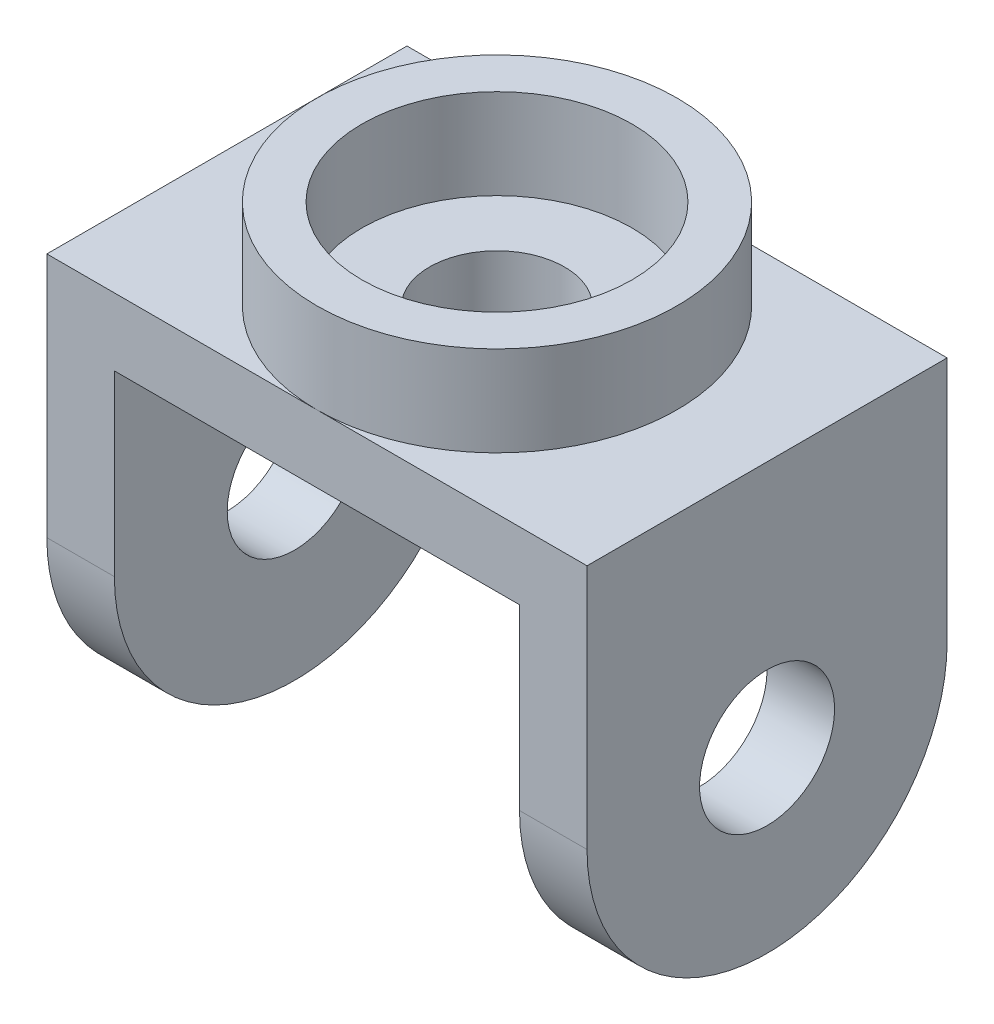
ISO-10303-21;
HEADER;
FILE_DESCRIPTION(('STEP AP214'),'2;1');
FILE_NAME('part.step','',(''),(''),'','','');
FILE_SCHEMA(('AUTOMOTIVE_DESIGN { 1 0 10303 214 1 1 1 1 }'));
ENDSEC;
DATA;
#1=APPLICATION_CONTEXT('core data for automotive mechanical design processes');
#2=APPLICATION_PROTOCOL_DEFINITION('international standard','automotive_design',2000,#1);
#3=PRODUCT_CONTEXT('',#1,'mechanical');
#4=PRODUCT('Part','Part','',(#3));
#5=PRODUCT_RELATED_PRODUCT_CATEGORY('part','',(#4));
#6=PRODUCT_DEFINITION_FORMATION('','',#4);
#7=PRODUCT_DEFINITION_CONTEXT('part definition',#1,'design');
#8=PRODUCT_DEFINITION('design','',#6,#7);
#9=PRODUCT_DEFINITION_SHAPE('','',#8);
#10=(LENGTH_UNIT() NAMED_UNIT(*) SI_UNIT(.MILLI.,.METRE.));
#11=(NAMED_UNIT(*) PLANE_ANGLE_UNIT() SI_UNIT($,.RADIAN.));
#12=(NAMED_UNIT(*) SI_UNIT($,.STERADIAN.) SOLID_ANGLE_UNIT());
#13=UNCERTAINTY_MEASURE_WITH_UNIT(LENGTH_MEASURE(1.E-05),#10,'distance_accuracy_value','');
#14=(GEOMETRIC_REPRESENTATION_CONTEXT(3) GLOBAL_UNCERTAINTY_ASSIGNED_CONTEXT((#13)) GLOBAL_UNIT_ASSIGNED_CONTEXT((#10,
#11,#12)) REPRESENTATION_CONTEXT('',''));
#15=CARTESIAN_POINT('',(0.,0.,0.));
#16=DIRECTION('',(0.,0.,1.));
#17=DIRECTION('',(1.,0.,0.));
#18=AXIS2_PLACEMENT_3D('',#15,#16,#17);
#19=CARTESIAN_POINT('',(0.,0.,0.));
#20=DIRECTION('',(0.,-1.,0.));
#21=DIRECTION('',(0.,0.,-1.));
#22=AXIS2_PLACEMENT_3D('',#19,#20,#21);
#23=PLANE('',#22);
#24=CARTESIAN_POINT('',(0.,0.,0.));
#25=DIRECTION('',(0.,1.,0.));
#26=DIRECTION('',(0.,0.,1.));
#27=AXIS2_PLACEMENT_3D('',#24,#25,#26);
#28=CIRCLE('',#27,3.81);
#29=CARTESIAN_POINT('',(0.,0.,3.81));
#30=VERTEX_POINT('',#29);
#31=EDGE_CURVE('E166',#30,#30,#28,.T.);
#32=ORIENTED_EDGE('',*,*,#31,.T.);
#33=EDGE_LOOP('',(#32));
#34=FACE_BOUND('',#33,.T.);
#35=DIRECTION('',(1.,0.,0.));
#36=VECTOR('',#35,1.);
#37=CARTESIAN_POINT('',(-15.24,0.,10.16));
#38=LINE('',#37,#36);
#39=CARTESIAN_POINT('',(-11.43,0.,10.16));
#40=VERTEX_POINT('',#39);
#41=CARTESIAN_POINT('',(11.43,0.,10.16));
#42=VERTEX_POINT('',#41);
#43=EDGE_CURVE('E186',#40,#42,#38,.T.);
#44=ORIENTED_EDGE('',*,*,#43,.F.);
#45=DIRECTION('',(0.,0.,-1.));
#46=VECTOR('',#45,1.);
#47=CARTESIAN_POINT('',(-11.43,0.,0.));
#48=LINE('',#47,#46);
#49=CARTESIAN_POINT('',(-11.43,0.,-10.16));
#50=VERTEX_POINT('',#49);
#51=EDGE_CURVE('E140',#40,#50,#48,.T.);
#52=ORIENTED_EDGE('',*,*,#51,.T.);
#53=DIRECTION('',(-1.,0.,0.));
#54=VECTOR('',#53,1.);
#55=CARTESIAN_POINT('',(-15.24,0.,-10.16));
#56=LINE('',#55,#54);
#57=CARTESIAN_POINT('',(11.43,0.,-10.16));
#58=VERTEX_POINT('',#57);
#59=EDGE_CURVE('E115',#58,#50,#56,.T.);
#60=ORIENTED_EDGE('',*,*,#59,.F.);
#61=DIRECTION('',(0.,0.,1.));
#62=VECTOR('',#61,1.);
#63=CARTESIAN_POINT('',(11.43,0.,0.));
#64=LINE('',#63,#62);
#65=EDGE_CURVE('E11',#58,#42,#64,.T.);
#66=ORIENTED_EDGE('',*,*,#65,.T.);
#67=EDGE_LOOP('',(#44,#52,#60,#66));
#68=FACE_BOUND('',#67,.T.);
#69=ADVANCED_FACE('F36',(#34,#68),#23,.T.);
#70=CARTESIAN_POINT('',(0.,3.81,0.));
#71=DIRECTION('',(0.,-1.,0.));
#72=DIRECTION('',(0.,0.,-1.));
#73=AXIS2_PLACEMENT_3D('',#70,#71,#72);
#74=PLANE('',#73);
#75=DIRECTION('',(-1.,0.,0.));
#76=VECTOR('',#75,1.);
#77=CARTESIAN_POINT('',(-15.24,3.81,-10.16));
#78=LINE('',#77,#76);
#79=CARTESIAN_POINT('',(15.24,3.81,-10.16));
#80=VERTEX_POINT('',#79);
#81=CARTESIAN_POINT('',(0.,3.81,-10.16));
#82=VERTEX_POINT('',#81);
#83=EDGE_CURVE('E51',#80,#82,#78,.T.);
#84=ORIENTED_EDGE('',*,*,#83,.T.);
#85=CARTESIAN_POINT('',(0.,3.81,0.));
#86=DIRECTION('',(0.,1.,0.));
#87=DIRECTION('',(0.,0.,1.));
#88=AXIS2_PLACEMENT_3D('',#85,#86,#87);
#89=CIRCLE('',#88,10.16);
#90=CARTESIAN_POINT('',(0.,3.81,10.16));
#91=VERTEX_POINT('',#90);
#92=EDGE_CURVE('E176',#91,#82,#89,.T.);
#93=ORIENTED_EDGE('',*,*,#92,.F.);
#94=DIRECTION('',(1.,0.,0.));
#95=VECTOR('',#94,1.);
#96=CARTESIAN_POINT('',(-15.24,3.81,10.16));
#97=LINE('',#96,#95);
#98=CARTESIAN_POINT('',(15.24,3.81,10.16));
#99=VERTEX_POINT('',#98);
#100=EDGE_CURVE('E56',#91,#99,#97,.T.);
#101=ORIENTED_EDGE('',*,*,#100,.T.);
#102=DIRECTION('',(0.,0.,-1.));
#103=VECTOR('',#102,1.);
#104=CARTESIAN_POINT('',(15.24,3.81,10.16));
#105=LINE('',#104,#103);
#106=EDGE_CURVE('E183',#99,#80,#105,.T.);
#107=ORIENTED_EDGE('',*,*,#106,.T.);
#108=EDGE_LOOP('',(#84,#93,#101,#107));
#109=FACE_BOUND('',#108,.T.);
#110=ADVANCED_FACE('F216',(#109),#74,.F.);
#111=CARTESIAN_POINT('',(15.24,3.81,10.16));
#112=DIRECTION('',(-1.,0.,0.));
#113=DIRECTION('',(0.,0.,1.));
#114=AXIS2_PLACEMENT_3D('',#111,#112,#113);
#115=PLANE('',#114);
#116=CARTESIAN_POINT('',(15.24,-10.16,0.));
#117=DIRECTION('',(1.,0.,0.));
#118=DIRECTION('',(0.,0.,-1.));
#119=AXIS2_PLACEMENT_3D('',#116,#117,#118);
#120=CIRCLE('',#119,3.81);
#121=CARTESIAN_POINT('',(15.24,-10.16,-3.81));
#122=VERTEX_POINT('',#121);
#123=EDGE_CURVE('E143',#122,#122,#120,.T.);
#124=ORIENTED_EDGE('',*,*,#123,.F.);
#125=EDGE_LOOP('',(#124));
#126=FACE_BOUND('',#125,.T.);
#127=DIRECTION('',(0.,-1.,0.));
#128=VECTOR('',#127,1.);
#129=CARTESIAN_POINT('',(15.24,3.81,10.16));
#130=LINE('',#129,#128);
#131=CARTESIAN_POINT('',(15.24,-10.0548097620958,10.16));
#132=VERTEX_POINT('',#131);
#133=EDGE_CURVE('E192',#99,#132,#130,.T.);
#134=ORIENTED_EDGE('',*,*,#133,.T.);
#135=CARTESIAN_POINT('',(15.24,-10.0548097620958,0.));
#136=DIRECTION('',(1.,0.,0.));
#137=DIRECTION('',(0.,0.,-1.));
#138=AXIS2_PLACEMENT_3D('',#135,#136,#137);
#139=CIRCLE('',#138,10.16);
#140=CARTESIAN_POINT('',(15.24,-10.0548097620958,-10.16));
#141=VERTEX_POINT('',#140);
#142=EDGE_CURVE('E147',#132,#141,#139,.T.);
#143=ORIENTED_EDGE('',*,*,#142,.T.);
#144=DIRECTION('',(0.,-1.,0.));
#145=VECTOR('',#144,1.);
#146=CARTESIAN_POINT('',(15.24,3.81,-10.16));
#147=LINE('',#146,#145);
#148=EDGE_CURVE('E199',#80,#141,#147,.T.);
#149=ORIENTED_EDGE('',*,*,#148,.F.);
#150=ORIENTED_EDGE('',*,*,#106,.F.);
#151=EDGE_LOOP('',(#134,#143,#149,#150));
#152=FACE_BOUND('',#151,.T.);
#153=ADVANCED_FACE('F38',(#126,#152),#115,.F.);
#154=CARTESIAN_POINT('',(-15.24,3.81,-10.16));
#155=DIRECTION('',(0.,0.,1.));
#156=DIRECTION('',(1.,0.,0.));
#157=AXIS2_PLACEMENT_3D('',#154,#155,#156);
#158=PLANE('',#157);
#159=DIRECTION('',(0.,-1.,0.));
#160=VECTOR('',#159,1.);
#161=CARTESIAN_POINT('',(-15.24,3.81,-10.16));
#162=LINE('',#161,#160);
#163=CARTESIAN_POINT('',(-15.24,3.81,-10.16));
#164=VERTEX_POINT('',#163);
#165=CARTESIAN_POINT('',(-15.24,-10.0548097620958,-10.16));
#166=VERTEX_POINT('',#165);
#167=EDGE_CURVE('E198',#164,#166,#162,.T.);
#168=ORIENTED_EDGE('',*,*,#167,.F.);
#169=EDGE_CURVE('E185',#82,#164,#78,.T.);
#170=ORIENTED_EDGE('',*,*,#169,.F.);
#171=ORIENTED_EDGE('',*,*,#83,.F.);
#172=ORIENTED_EDGE('',*,*,#148,.T.);
#173=DIRECTION('',(1.,0.,0.));
#174=VECTOR('',#173,1.);
#175=CARTESIAN_POINT('',(11.43,-10.0548097620958,-10.16));
#176=LINE('',#175,#174);
#177=CARTESIAN_POINT('',(11.43,-10.0548097620958,-10.16));
#178=VERTEX_POINT('',#177);
#179=EDGE_CURVE('E160',#178,#141,#176,.T.);
#180=ORIENTED_EDGE('',*,*,#179,.F.);
#181=DIRECTION('',(0.,1.,0.));
#182=VECTOR('',#181,1.);
#183=CARTESIAN_POINT('',(11.43,3.81,-10.16));
#184=LINE('',#183,#182);
#185=EDGE_CURVE('E155',#178,#58,#184,.T.);
#186=ORIENTED_EDGE('',*,*,#185,.T.);
#187=ORIENTED_EDGE('',*,*,#59,.T.);
#188=DIRECTION('',(0.,-1.,0.));
#189=VECTOR('',#188,1.);
#190=CARTESIAN_POINT('',(-11.43,3.81,-10.16));
#191=LINE('',#190,#189);
#192=CARTESIAN_POINT('',(-11.43,-10.0548097620958,-10.16));
#193=VERTEX_POINT('',#192);
#194=EDGE_CURVE('E107',#50,#193,#191,.T.);
#195=ORIENTED_EDGE('',*,*,#194,.T.);
#196=DIRECTION('',(-1.,0.,0.));
#197=VECTOR('',#196,1.);
#198=CARTESIAN_POINT('',(-11.43,-10.0548097620958,-10.16));
#199=LINE('',#198,#197);
#200=EDGE_CURVE('E111',#193,#166,#199,.T.);
#201=ORIENTED_EDGE('',*,*,#200,.T.);
#202=EDGE_LOOP('',(#168,#170,#171,#172,#180,#186,#187,#195,#201));
#203=FACE_BOUND('',#202,.T.);
#204=ADVANCED_FACE('F110',(#203),#158,.F.);
#205=CARTESIAN_POINT('',(-15.24,3.81,10.16));
#206=DIRECTION('',(1.,0.,0.));
#207=DIRECTION('',(0.,0.,-1.));
#208=AXIS2_PLACEMENT_3D('',#205,#206,#207);
#209=PLANE('',#208);
#210=ORIENTED_EDGE('',*,*,#167,.T.);
#211=CARTESIAN_POINT('',(-15.24,-10.0548097620958,0.));
#212=DIRECTION('',(-1.,0.,0.));
#213=DIRECTION('',(0.,0.,1.));
#214=AXIS2_PLACEMENT_3D('',#211,#212,#213);
#215=CIRCLE('',#214,10.16);
#216=CARTESIAN_POINT('',(-15.24,-10.0548097620958,10.16));
#217=VERTEX_POINT('',#216);
#218=EDGE_CURVE('E120',#166,#217,#215,.T.);
#219=ORIENTED_EDGE('',*,*,#218,.T.);
#220=DIRECTION('',(0.,-1.,0.));
#221=VECTOR('',#220,1.);
#222=CARTESIAN_POINT('',(-15.24,3.81,10.16));
#223=LINE('',#222,#221);
#224=CARTESIAN_POINT('',(-15.24,3.81,10.16));
#225=VERTEX_POINT('',#224);
#226=EDGE_CURVE('E196',#225,#217,#223,.T.);
#227=ORIENTED_EDGE('',*,*,#226,.F.);
#228=DIRECTION('',(0.,0.,1.));
#229=VECTOR('',#228,1.);
#230=CARTESIAN_POINT('',(-15.24,3.81,10.16));
#231=LINE('',#230,#229);
#232=EDGE_CURVE('E188',#164,#225,#231,.T.);
#233=ORIENTED_EDGE('',*,*,#232,.F.);
#234=EDGE_LOOP('',(#210,#219,#227,#233));
#235=FACE_BOUND('',#234,.T.);
#236=CARTESIAN_POINT('',(-15.24,-10.0548097620958,0.));
#237=DIRECTION('',(-1.,0.,0.));
#238=DIRECTION('',(0.,0.,1.));
#239=AXIS2_PLACEMENT_3D('',#236,#237,#238);
#240=CIRCLE('',#239,3.79184550826935);
#241=CARTESIAN_POINT('',(-15.24,-10.0548097620958,3.79184550826935));
#242=VERTEX_POINT('',#241);
#243=EDGE_CURVE('E280',#242,#242,#240,.T.);
#244=ORIENTED_EDGE('',*,*,#243,.F.);
#245=EDGE_LOOP('',(#244));
#246=FACE_BOUND('',#245,.T.);
#247=ADVANCED_FACE('F211',(#235,#246),#209,.F.);
#248=CARTESIAN_POINT('',(-15.24,3.81,10.16));
#249=DIRECTION('',(0.,0.,-1.));
#250=DIRECTION('',(-1.,0.,0.));
#251=AXIS2_PLACEMENT_3D('',#248,#249,#250);
#252=PLANE('',#251);
#253=ORIENTED_EDGE('',*,*,#226,.T.);
#254=DIRECTION('',(-1.,0.,0.));
#255=VECTOR('',#254,1.);
#256=CARTESIAN_POINT('',(-11.43,-10.0548097620958,10.16));
#257=LINE('',#256,#255);
#258=CARTESIAN_POINT('',(-11.43,-10.0548097620958,10.16));
#259=VERTEX_POINT('',#258);
#260=EDGE_CURVE('E128',#259,#217,#257,.T.);
#261=ORIENTED_EDGE('',*,*,#260,.F.);
#262=DIRECTION('',(0.,1.,0.));
#263=VECTOR('',#262,1.);
#264=CARTESIAN_POINT('',(-11.43,3.81,10.16));
#265=LINE('',#264,#263);
#266=EDGE_CURVE('E129',#259,#40,#265,.T.);
#267=ORIENTED_EDGE('',*,*,#266,.T.);
#268=ORIENTED_EDGE('',*,*,#43,.T.);
#269=DIRECTION('',(0.,-1.,0.));
#270=VECTOR('',#269,1.);
#271=CARTESIAN_POINT('',(11.43,3.81,10.16));
#272=LINE('',#271,#270);
#273=CARTESIAN_POINT('',(11.43,-10.0548097620958,10.16));
#274=VERTEX_POINT('',#273);
#275=EDGE_CURVE('E150',#42,#274,#272,.T.);
#276=ORIENTED_EDGE('',*,*,#275,.T.);
#277=DIRECTION('',(1.,0.,0.));
#278=VECTOR('',#277,1.);
#279=CARTESIAN_POINT('',(11.43,-10.0548097620958,10.16));
#280=LINE('',#279,#278);
#281=EDGE_CURVE('E157',#274,#132,#280,.T.);
#282=ORIENTED_EDGE('',*,*,#281,.T.);
#283=ORIENTED_EDGE('',*,*,#133,.F.);
#284=ORIENTED_EDGE('',*,*,#100,.F.);
#285=EDGE_CURVE('E190',#225,#91,#97,.T.);
#286=ORIENTED_EDGE('',*,*,#285,.F.);
#287=EDGE_LOOP('',(#253,#261,#267,#268,#276,#282,#283,#284,#286));
#288=FACE_BOUND('',#287,.T.);
#289=ADVANCED_FACE('F214',(#288),#252,.F.);
#290=ORIENTED_EDGE('',*,*,#285,.T.);
#291=EDGE_CURVE('E44',#82,#91,#89,.T.);
#292=ORIENTED_EDGE('',*,*,#291,.F.);
#293=ORIENTED_EDGE('',*,*,#169,.T.);
#294=ORIENTED_EDGE('',*,*,#232,.T.);
#295=EDGE_LOOP('',(#290,#292,#293,#294));
#296=FACE_BOUND('',#295,.T.);
#297=ADVANCED_FACE('F206',(#296),#74,.F.);
#298=CARTESIAN_POINT('',(0.,8.89,0.));
#299=DIRECTION('',(0.,-1.,0.));
#300=DIRECTION('',(0.,0.,-1.));
#301=AXIS2_PLACEMENT_3D('',#298,#299,#300);
#302=CYLINDRICAL_SURFACE('',#301,7.62);
#303=CARTESIAN_POINT('',(0.,8.89,0.));
#304=DIRECTION('',(0.,1.,0.));
#305=DIRECTION('',(0.,0.,1.));
#306=AXIS2_PLACEMENT_3D('',#303,#304,#305);
#307=CIRCLE('',#306,7.62);
#308=CARTESIAN_POINT('',(0.,8.89,7.62));
#309=VERTEX_POINT('',#308);
#310=EDGE_CURVE('E172',#309,#309,#307,.T.);
#311=ORIENTED_EDGE('',*,*,#310,.T.);
#312=EDGE_LOOP('',(#311));
#313=FACE_BOUND('',#312,.T.);
#314=CARTESIAN_POINT('',(0.,3.81,0.));
#315=DIRECTION('',(0.,1.,0.));
#316=DIRECTION('',(0.,0.,1.));
#317=AXIS2_PLACEMENT_3D('',#314,#315,#316);
#318=CIRCLE('',#317,7.62);
#319=CARTESIAN_POINT('',(0.,3.81,7.62));
#320=VERTEX_POINT('',#319);
#321=EDGE_CURVE('E169',#320,#320,#318,.T.);
#322=ORIENTED_EDGE('',*,*,#321,.F.);
#323=EDGE_LOOP('',(#322));
#324=FACE_BOUND('',#323,.T.);
#325=ADVANCED_FACE('F229',(#313,#324),#302,.F.);
#326=CARTESIAN_POINT('',(0.,8.89,0.));
#327=DIRECTION('',(0.,-1.,0.));
#328=DIRECTION('',(0.,0.,-1.));
#329=AXIS2_PLACEMENT_3D('',#326,#327,#328);
#330=CYLINDRICAL_SURFACE('',#329,10.16);
#331=CARTESIAN_POINT('',(0.,8.89,0.));
#332=DIRECTION('',(0.,1.,0.));
#333=DIRECTION('',(0.,0.,1.));
#334=AXIS2_PLACEMENT_3D('',#331,#332,#333);
#335=CIRCLE('',#334,10.16);
#336=CARTESIAN_POINT('',(0.,8.89,10.16));
#337=VERTEX_POINT('',#336);
#338=EDGE_CURVE('E175',#337,#337,#335,.T.);
#339=ORIENTED_EDGE('',*,*,#338,.F.);
#340=EDGE_LOOP('',(#339));
#341=FACE_BOUND('',#340,.T.);
#342=ORIENTED_EDGE('',*,*,#92,.T.);
#343=ORIENTED_EDGE('',*,*,#291,.T.);
#344=EDGE_LOOP('',(#342,#343));
#345=FACE_BOUND('',#344,.T.);
#346=ADVANCED_FACE('F203',(#341,#345),#330,.T.);
#347=CARTESIAN_POINT('',(0.,8.89,0.));
#348=DIRECTION('',(0.,1.,0.));
#349=DIRECTION('',(0.,0.,1.));
#350=AXIS2_PLACEMENT_3D('',#347,#348,#349);
#351=PLANE('',#350);
#352=ORIENTED_EDGE('',*,*,#310,.F.);
#353=EDGE_LOOP('',(#352));
#354=FACE_BOUND('',#353,.T.);
#355=ORIENTED_EDGE('',*,*,#338,.T.);
#356=EDGE_LOOP('',(#355));
#357=FACE_BOUND('',#356,.T.);
#358=ADVANCED_FACE('F232',(#354,#357),#351,.T.);
#359=CARTESIAN_POINT('',(0.,3.81,0.));
#360=DIRECTION('',(0.,1.,0.));
#361=DIRECTION('',(0.,0.,1.));
#362=AXIS2_PLACEMENT_3D('',#359,#360,#361);
#363=CIRCLE('',#362,3.81);
#364=CARTESIAN_POINT('',(0.,3.81,3.81));
#365=VERTEX_POINT('',#364);
#366=EDGE_CURVE('E163',#365,#365,#363,.T.);
#367=ORIENTED_EDGE('',*,*,#366,.F.);
#368=EDGE_LOOP('',(#367));
#369=FACE_BOUND('',#368,.T.);
#370=ORIENTED_EDGE('',*,*,#321,.T.);
#371=EDGE_LOOP('',(#370));
#372=FACE_BOUND('',#371,.T.);
#373=ADVANCED_FACE('F219',(#369,#372),#74,.F.);
#374=CARTESIAN_POINT('',(0.,0.,0.));
#375=DIRECTION('',(0.,1.,0.));
#376=DIRECTION('',(0.,0.,1.));
#377=AXIS2_PLACEMENT_3D('',#374,#375,#376);
#378=CYLINDRICAL_SURFACE('',#377,3.81);
#379=CARTESIAN_POINT('',(0.,0.,3.81));
#380=CARTESIAN_POINT('',(0.,0.0396874999999999,3.81));
#381=CARTESIAN_POINT('',(0.,0.079375,3.81));
#382=CARTESIAN_POINT('',(0.,0.15875,3.81));
#383=CARTESIAN_POINT('',(0.,0.1984375,3.81));
#384=CARTESIAN_POINT('',(0.,0.2778125,3.81));
#385=CARTESIAN_POINT('',(0.,0.3175,3.81));
#386=CARTESIAN_POINT('',(0.,0.396875,3.81));
#387=CARTESIAN_POINT('',(0.,0.4365625,3.81));
#388=CARTESIAN_POINT('',(0.,0.5159375,3.81));
#389=CARTESIAN_POINT('',(0.,0.555625,3.81));
#390=CARTESIAN_POINT('',(0.,0.635,3.81));
#391=CARTESIAN_POINT('',(0.,0.6746875,3.81));
#392=CARTESIAN_POINT('',(0.,0.7540625,3.81));
#393=CARTESIAN_POINT('',(0.,0.79375,3.81));
#394=CARTESIAN_POINT('',(0.,0.873125,3.81));
#395=CARTESIAN_POINT('',(0.,0.9128125,3.81));
#396=CARTESIAN_POINT('',(0.,0.9921875,3.81));
#397=CARTESIAN_POINT('',(0.,1.031875,3.81));
#398=CARTESIAN_POINT('',(0.,1.11125,3.81));
#399=CARTESIAN_POINT('',(0.,1.1509375,3.81));
#400=CARTESIAN_POINT('',(0.,1.2303125,3.81));
#401=CARTESIAN_POINT('',(0.,1.27,3.81));
#402=CARTESIAN_POINT('',(0.,1.349375,3.81));
#403=CARTESIAN_POINT('',(0.,1.3890625,3.81));
#404=CARTESIAN_POINT('',(0.,1.4684375,3.81));
#405=CARTESIAN_POINT('',(0.,1.508125,3.81));
#406=CARTESIAN_POINT('',(0.,1.5875,3.81));
#407=CARTESIAN_POINT('',(0.,1.6271875,3.81));
#408=CARTESIAN_POINT('',(0.,1.7065625,3.81));
#409=CARTESIAN_POINT('',(0.,1.74625,3.81));
#410=CARTESIAN_POINT('',(0.,1.825625,3.81));
#411=CARTESIAN_POINT('',(0.,1.8653125,3.81));
#412=CARTESIAN_POINT('',(0.,1.9446875,3.81));
#413=CARTESIAN_POINT('',(0.,1.984375,3.81));
#414=CARTESIAN_POINT('',(0.,2.06375,3.81));
#415=CARTESIAN_POINT('',(0.,2.1034375,3.81));
#416=CARTESIAN_POINT('',(0.,2.1828125,3.81));
#417=CARTESIAN_POINT('',(0.,2.2225,3.81));
#418=CARTESIAN_POINT('',(0.,2.301875,3.81));
#419=CARTESIAN_POINT('',(0.,2.3415625,3.81));
#420=CARTESIAN_POINT('',(0.,2.4209375,3.81));
#421=CARTESIAN_POINT('',(0.,2.460625,3.81));
#422=CARTESIAN_POINT('',(0.,2.54,3.81));
#423=CARTESIAN_POINT('',(0.,2.5796875,3.81));
#424=CARTESIAN_POINT('',(0.,2.6590625,3.81));
#425=CARTESIAN_POINT('',(0.,2.69875,3.81));
#426=CARTESIAN_POINT('',(0.,2.778125,3.81));
#427=CARTESIAN_POINT('',(0.,2.8178125,3.81));
#428=CARTESIAN_POINT('',(0.,2.8971875,3.81));
#429=CARTESIAN_POINT('',(0.,2.936875,3.81));
#430=CARTESIAN_POINT('',(0.,3.01625,3.81));
#431=CARTESIAN_POINT('',(0.,3.0559375,3.81));
#432=CARTESIAN_POINT('',(0.,3.1353125,3.81));
#433=CARTESIAN_POINT('',(0.,3.175,3.81));
#434=CARTESIAN_POINT('',(0.,3.254375,3.81));
#435=CARTESIAN_POINT('',(0.,3.2940625,3.81));
#436=CARTESIAN_POINT('',(0.,3.3734375,3.81));
#437=CARTESIAN_POINT('',(0.,3.413125,3.81));
#438=CARTESIAN_POINT('',(0.,3.4925,3.81));
#439=CARTESIAN_POINT('',(0.,3.5321875,3.81));
#440=CARTESIAN_POINT('',(0.,3.6115625,3.81));
#441=CARTESIAN_POINT('',(0.,3.65125,3.81));
#442=CARTESIAN_POINT('',(0.,3.730625,3.81));
#443=CARTESIAN_POINT('',(0.,3.7703125,3.81));
#444=CARTESIAN_POINT('',(0.,3.81,3.81));
#445=B_SPLINE_CURVE_WITH_KNOTS('',3,(#379,#380,#381,#382,#383,#384,#385,#386,#387,#388,#389,
#390,#391,#392,#393,#394,#395,#396,#397,#398,#399,#400,#401,#402,#403,#404,#405,#406,#407,#408,
#409,#410,#411,#412,#413,#414,#415,#416,#417,#418,#419,#420,#421,#422,#423,#424,#425,#426,#427,
#428,#429,#430,#431,#432,#433,#434,#435,#436,#437,#438,#439,#440,#441,#442,#443,#444),
.UNSPECIFIED.,.F.,.F.,(4,2,2,2,2,2,2,2,2,2,2,2,2,2,2,2,2,2,2,2,2,2,2,2,2,2,2,2,2,2,2,2,4),(0.,
0.1190625,0.238125,0.3571875,0.47625,0.5953125,0.714375,0.8334375,0.9525,1.0715625,1.190625,
1.3096875,1.42875,1.5478125,1.666875,1.7859375,1.905,2.0240625,2.143125,2.2621875,2.38125,
2.5003125,2.619375,2.7384375,2.8575,2.9765625,3.095625,3.2146875,3.33375,3.4528125,3.571875,
3.6909375,3.81),.UNSPECIFIED.);
#446=EDGE_CURVE('BSEAM231',#30,#365,#445,.T.);
#447=ORIENTED_EDGE('',*,*,#31,.F.);
#448=ORIENTED_EDGE('',*,*,#366,.T.);
#449=ORIENTED_EDGE('',*,*,#446,.T.);
#450=ORIENTED_EDGE('',*,*,#446,.F.);
#451=EDGE_LOOP('',(#447,#449,#448,#450));
#452=FACE_BOUND('',#451,.T.);
#453=ADVANCED_FACE('F231',(#452),#378,.F.);
#454=CARTESIAN_POINT('',(11.43,-10.0548097620958,0.));
#455=DIRECTION('',(1.,0.,0.));
#456=DIRECTION('',(0.,0.,-1.));
#457=AXIS2_PLACEMENT_3D('',#454,#455,#456);
#458=CYLINDRICAL_SURFACE('',#457,10.16);
#459=ORIENTED_EDGE('',*,*,#142,.F.);
#460=ORIENTED_EDGE('',*,*,#281,.F.);
#461=CARTESIAN_POINT('',(11.43,-10.0548097620958,0.));
#462=DIRECTION('',(1.,0.,0.));
#463=DIRECTION('',(0.,0.,-1.));
#464=AXIS2_PLACEMENT_3D('',#461,#462,#463);
#465=CIRCLE('',#464,10.16);
#466=EDGE_CURVE('E152',#274,#178,#465,.T.);
#467=ORIENTED_EDGE('',*,*,#466,.T.);
#468=ORIENTED_EDGE('',*,*,#179,.T.);
#469=EDGE_LOOP('',(#459,#460,#467,#468));
#470=FACE_BOUND('',#469,.T.);
#471=ADVANCED_FACE('F238',(#470),#458,.T.);
#472=CARTESIAN_POINT('',(11.43,-10.0548097620958,0.));
#473=DIRECTION('',(1.,0.,0.));
#474=DIRECTION('',(0.,0.,-1.));
#475=AXIS2_PLACEMENT_3D('',#472,#473,#474);
#476=PLANE('',#475);
#477=CARTESIAN_POINT('',(11.43,-10.16,0.));
#478=DIRECTION('',(1.,0.,0.));
#479=DIRECTION('',(0.,0.,-1.));
#480=AXIS2_PLACEMENT_3D('',#477,#478,#479);
#481=CIRCLE('',#480,3.81);
#482=CARTESIAN_POINT('',(11.43,-10.16,-3.81));
#483=VERTEX_POINT('',#482);
#484=EDGE_CURVE('E144',#483,#483,#481,.T.);
#485=ORIENTED_EDGE('',*,*,#484,.T.);
#486=EDGE_LOOP('',(#485));
#487=FACE_BOUND('',#486,.T.);
#488=ORIENTED_EDGE('',*,*,#65,.F.);
#489=ORIENTED_EDGE('',*,*,#185,.F.);
#490=ORIENTED_EDGE('',*,*,#466,.F.);
#491=ORIENTED_EDGE('',*,*,#275,.F.);
#492=EDGE_LOOP('',(#488,#489,#490,#491));
#493=FACE_BOUND('',#492,.T.);
#494=ADVANCED_FACE('F257',(#487,#493),#476,.F.);
#495=CARTESIAN_POINT('',(11.43,-10.16,0.));
#496=DIRECTION('',(1.,0.,0.));
#497=DIRECTION('',(0.,0.,-1.));
#498=AXIS2_PLACEMENT_3D('',#495,#496,#497);
#499=CYLINDRICAL_SURFACE('',#498,3.81);
#500=CARTESIAN_POINT('',(11.43,-10.16,-3.81));
#501=CARTESIAN_POINT('',(11.4696875,-10.16,-3.81));
#502=CARTESIAN_POINT('',(11.509375,-10.16,-3.81));
#503=CARTESIAN_POINT('',(11.58875,-10.16,-3.81));
#504=CARTESIAN_POINT('',(11.6284375,-10.16,-3.81));
#505=CARTESIAN_POINT('',(11.7078125,-10.16,-3.81));
#506=CARTESIAN_POINT('',(11.7475,-10.16,-3.81));
#507=CARTESIAN_POINT('',(11.826875,-10.16,-3.81));
#508=CARTESIAN_POINT('',(11.8665625,-10.16,-3.81));
#509=CARTESIAN_POINT('',(11.9459375,-10.16,-3.81));
#510=CARTESIAN_POINT('',(11.985625,-10.16,-3.81));
#511=CARTESIAN_POINT('',(12.065,-10.16,-3.81));
#512=CARTESIAN_POINT('',(12.1046875,-10.16,-3.81));
#513=CARTESIAN_POINT('',(12.1840625,-10.16,-3.81));
#514=CARTESIAN_POINT('',(12.22375,-10.16,-3.81));
#515=CARTESIAN_POINT('',(12.303125,-10.16,-3.81));
#516=CARTESIAN_POINT('',(12.3428125,-10.16,-3.81));
#517=CARTESIAN_POINT('',(12.4221875,-10.16,-3.81));
#518=CARTESIAN_POINT('',(12.461875,-10.16,-3.81));
#519=CARTESIAN_POINT('',(12.54125,-10.16,-3.81));
#520=CARTESIAN_POINT('',(12.5809375,-10.16,-3.81));
#521=CARTESIAN_POINT('',(12.6603125,-10.16,-3.81));
#522=CARTESIAN_POINT('',(12.7,-10.16,-3.81));
#523=CARTESIAN_POINT('',(12.779375,-10.16,-3.81));
#524=CARTESIAN_POINT('',(12.8190625,-10.16,-3.81));
#525=CARTESIAN_POINT('',(12.8984375,-10.16,-3.81));
#526=CARTESIAN_POINT('',(12.938125,-10.16,-3.81));
#527=CARTESIAN_POINT('',(13.0175,-10.16,-3.81));
#528=CARTESIAN_POINT('',(13.0571875,-10.16,-3.81));
#529=CARTESIAN_POINT('',(13.1365625,-10.16,-3.81));
#530=CARTESIAN_POINT('',(13.17625,-10.16,-3.81));
#531=CARTESIAN_POINT('',(13.255625,-10.16,-3.81));
#532=CARTESIAN_POINT('',(13.2953125,-10.16,-3.81));
#533=CARTESIAN_POINT('',(13.3746875,-10.16,-3.81));
#534=CARTESIAN_POINT('',(13.414375,-10.16,-3.81));
#535=CARTESIAN_POINT('',(13.49375,-10.16,-3.81));
#536=CARTESIAN_POINT('',(13.5334375,-10.16,-3.81));
#537=CARTESIAN_POINT('',(13.6128125,-10.16,-3.81));
#538=CARTESIAN_POINT('',(13.6525,-10.16,-3.81));
#539=CARTESIAN_POINT('',(13.731875,-10.16,-3.81));
#540=CARTESIAN_POINT('',(13.7715625,-10.16,-3.81));
#541=CARTESIAN_POINT('',(13.8509375,-10.16,-3.81));
#542=CARTESIAN_POINT('',(13.890625,-10.16,-3.81));
#543=CARTESIAN_POINT('',(13.97,-10.16,-3.81));
#544=CARTESIAN_POINT('',(14.0096875,-10.16,-3.81));
#545=CARTESIAN_POINT('',(14.0890625,-10.16,-3.81));
#546=CARTESIAN_POINT('',(14.12875,-10.16,-3.81));
#547=CARTESIAN_POINT('',(14.208125,-10.16,-3.81));
#548=CARTESIAN_POINT('',(14.2478125,-10.16,-3.81));
#549=CARTESIAN_POINT('',(14.3271875,-10.16,-3.81));
#550=CARTESIAN_POINT('',(14.366875,-10.16,-3.81));
#551=CARTESIAN_POINT('',(14.44625,-10.16,-3.81));
#552=CARTESIAN_POINT('',(14.4859375,-10.16,-3.81));
#553=CARTESIAN_POINT('',(14.5653125,-10.16,-3.81));
#554=CARTESIAN_POINT('',(14.605,-10.16,-3.81));
#555=CARTESIAN_POINT('',(14.684375,-10.16,-3.81));
#556=CARTESIAN_POINT('',(14.7240625,-10.16,-3.81));
#557=CARTESIAN_POINT('',(14.8034375,-10.16,-3.81));
#558=CARTESIAN_POINT('',(14.843125,-10.16,-3.81));
#559=CARTESIAN_POINT('',(14.9225,-10.16,-3.81));
#560=CARTESIAN_POINT('',(14.9621875,-10.16,-3.81));
#561=CARTESIAN_POINT('',(15.0415625,-10.16,-3.81));
#562=CARTESIAN_POINT('',(15.08125,-10.16,-3.81));
#563=CARTESIAN_POINT('',(15.160625,-10.16,-3.81));
#564=CARTESIAN_POINT('',(15.2003125,-10.16,-3.81));
#565=CARTESIAN_POINT('',(15.24,-10.16,-3.81));
#566=B_SPLINE_CURVE_WITH_KNOTS('',3,(#500,#501,#502,#503,#504,#505,#506,#507,#508,#509,#510,
#511,#512,#513,#514,#515,#516,#517,#518,#519,#520,#521,#522,#523,#524,#525,#526,#527,#528,#529,
#530,#531,#532,#533,#534,#535,#536,#537,#538,#539,#540,#541,#542,#543,#544,#545,#546,#547,#548,
#549,#550,#551,#552,#553,#554,#555,#556,#557,#558,#559,#560,#561,#562,#563,#564,#565),
.UNSPECIFIED.,.F.,.F.,(4,2,2,2,2,2,2,2,2,2,2,2,2,2,2,2,2,2,2,2,2,2,2,2,2,2,2,2,2,2,2,2,4),(0.,
0.119062499999999,0.238124999999999,0.3571875,0.476249999999999,0.595312499999999,
0.714374999999998,0.833437499999999,0.952499999999998,1.0715625,1.190625,1.3096875,1.42875,
1.5478125,1.666875,1.7859375,1.905,2.0240625,2.143125,2.2621875,2.38125,2.5003125,2.619375,
2.7384375,2.8575,2.9765625,3.095625,3.2146875,3.33375,3.4528125,3.571875,3.6909375,3.81),.UNSPECIFIED.);
#567=EDGE_CURVE('BSEAM261',#483,#122,#566,.T.);
#568=ORIENTED_EDGE('',*,*,#484,.F.);
#569=ORIENTED_EDGE('',*,*,#123,.T.);
#570=ORIENTED_EDGE('',*,*,#567,.T.);
#571=ORIENTED_EDGE('',*,*,#567,.F.);
#572=EDGE_LOOP('',(#568,#570,#569,#571));
#573=FACE_BOUND('',#572,.T.);
#574=ADVANCED_FACE('F261',(#573),#499,.F.);
#575=CARTESIAN_POINT('',(-11.43,-10.0548097620958,0.));
#576=DIRECTION('',(-1.,0.,0.));
#577=DIRECTION('',(0.,0.,1.));
#578=AXIS2_PLACEMENT_3D('',#575,#576,#577);
#579=CYLINDRICAL_SURFACE('',#578,10.16);
#580=ORIENTED_EDGE('',*,*,#218,.F.);
#581=ORIENTED_EDGE('',*,*,#200,.F.);
#582=CARTESIAN_POINT('',(-11.43,-10.0548097620958,0.));
#583=DIRECTION('',(-1.,0.,0.));
#584=DIRECTION('',(0.,0.,1.));
#585=AXIS2_PLACEMENT_3D('',#582,#583,#584);
#586=CIRCLE('',#585,10.16);
#587=EDGE_CURVE('E119',#193,#259,#586,.T.);
#588=ORIENTED_EDGE('',*,*,#587,.T.);
#589=ORIENTED_EDGE('',*,*,#260,.T.);
#590=EDGE_LOOP('',(#580,#581,#588,#589));
#591=FACE_BOUND('',#590,.T.);
#592=ADVANCED_FACE('F124',(#591),#579,.T.);
#593=CARTESIAN_POINT('',(-11.43,-10.0548097620958,0.));
#594=DIRECTION('',(-1.,0.,0.));
#595=DIRECTION('',(0.,0.,1.));
#596=AXIS2_PLACEMENT_3D('',#593,#594,#595);
#597=PLANE('',#596);
#598=ORIENTED_EDGE('',*,*,#51,.F.);
#599=ORIENTED_EDGE('',*,*,#266,.F.);
#600=ORIENTED_EDGE('',*,*,#587,.F.);
#601=ORIENTED_EDGE('',*,*,#194,.F.);
#602=EDGE_LOOP('',(#598,#599,#600,#601));
#603=FACE_BOUND('',#602,.T.);
#604=CARTESIAN_POINT('',(-11.43,-10.0548097620958,0.));
#605=DIRECTION('',(-1.,0.,0.));
#606=DIRECTION('',(0.,0.,1.));
#607=AXIS2_PLACEMENT_3D('',#604,#605,#606);
#608=CIRCLE('',#607,3.79184550826935);
#609=CARTESIAN_POINT('',(-11.43,-10.0548097620958,3.79184550826935));
#610=VERTEX_POINT('',#609);
#611=EDGE_CURVE('E139',#610,#610,#608,.T.);
#612=ORIENTED_EDGE('',*,*,#611,.T.);
#613=EDGE_LOOP('',(#612));
#614=FACE_BOUND('',#613,.T.);
#615=ADVANCED_FACE('F131',(#603,#614),#597,.F.);
#616=CARTESIAN_POINT('',(-11.43,-10.0548097620958,0.));
#617=DIRECTION('',(-1.,0.,0.));
#618=DIRECTION('',(0.,0.,1.));
#619=AXIS2_PLACEMENT_3D('',#616,#617,#618);
#620=CYLINDRICAL_SURFACE('',#619,3.79184550826935);
#621=CARTESIAN_POINT('',(-11.43,-10.0548097620958,3.79184550826935));
#622=CARTESIAN_POINT('',(-11.4696875,-10.0548097620958,3.79184550826935));
#623=CARTESIAN_POINT('',(-11.509375,-10.0548097620958,3.79184550826935));
#624=CARTESIAN_POINT('',(-11.58875,-10.0548097620958,3.79184550826935));
#625=CARTESIAN_POINT('',(-11.6284375,-10.0548097620958,3.79184550826935));
#626=CARTESIAN_POINT('',(-11.7078125,-10.0548097620958,3.79184550826935));
#627=CARTESIAN_POINT('',(-11.7475,-10.0548097620958,3.79184550826935));
#628=CARTESIAN_POINT('',(-11.826875,-10.0548097620958,3.79184550826935));
#629=CARTESIAN_POINT('',(-11.8665625,-10.0548097620958,3.79184550826935));
#630=CARTESIAN_POINT('',(-11.9459375,-10.0548097620958,3.79184550826935));
#631=CARTESIAN_POINT('',(-11.985625,-10.0548097620958,3.79184550826935));
#632=CARTESIAN_POINT('',(-12.065,-10.0548097620958,3.79184550826935));
#633=CARTESIAN_POINT('',(-12.1046875,-10.0548097620958,3.79184550826935));
#634=CARTESIAN_POINT('',(-12.1840625,-10.0548097620958,3.79184550826935));
#635=CARTESIAN_POINT('',(-12.22375,-10.0548097620958,3.79184550826935));
#636=CARTESIAN_POINT('',(-12.303125,-10.0548097620958,3.79184550826935));
#637=CARTESIAN_POINT('',(-12.3428125,-10.0548097620958,3.79184550826935));
#638=CARTESIAN_POINT('',(-12.4221875,-10.0548097620958,3.79184550826935));
#639=CARTESIAN_POINT('',(-12.461875,-10.0548097620958,3.79184550826935));
#640=CARTESIAN_POINT('',(-12.54125,-10.0548097620958,3.79184550826935));
#641=CARTESIAN_POINT('',(-12.5809375,-10.0548097620958,3.79184550826935));
#642=CARTESIAN_POINT('',(-12.6603125,-10.0548097620958,3.79184550826935));
#643=CARTESIAN_POINT('',(-12.7,-10.0548097620958,3.79184550826935));
#644=CARTESIAN_POINT('',(-12.779375,-10.0548097620958,3.79184550826935));
#645=CARTESIAN_POINT('',(-12.8190625,-10.0548097620958,3.79184550826935));
#646=CARTESIAN_POINT('',(-12.8984375,-10.0548097620958,3.79184550826935));
#647=CARTESIAN_POINT('',(-12.938125,-10.0548097620958,3.79184550826935));
#648=CARTESIAN_POINT('',(-13.0175,-10.0548097620958,3.79184550826935));
#649=CARTESIAN_POINT('',(-13.0571875,-10.0548097620958,3.79184550826935));
#650=CARTESIAN_POINT('',(-13.1365625,-10.0548097620958,3.79184550826935));
#651=CARTESIAN_POINT('',(-13.17625,-10.0548097620958,3.79184550826935));
#652=CARTESIAN_POINT('',(-13.255625,-10.0548097620958,3.79184550826935));
#653=CARTESIAN_POINT('',(-13.2953125,-10.0548097620958,3.79184550826935));
#654=CARTESIAN_POINT('',(-13.3746875,-10.0548097620958,3.79184550826935));
#655=CARTESIAN_POINT('',(-13.414375,-10.0548097620958,3.79184550826935));
#656=CARTESIAN_POINT('',(-13.49375,-10.0548097620958,3.79184550826935));
#657=CARTESIAN_POINT('',(-13.5334375,-10.0548097620958,3.79184550826935));
#658=CARTESIAN_POINT('',(-13.6128125,-10.0548097620958,3.79184550826935));
#659=CARTESIAN_POINT('',(-13.6525,-10.0548097620958,3.79184550826935));
#660=CARTESIAN_POINT('',(-13.731875,-10.0548097620958,3.79184550826935));
#661=CARTESIAN_POINT('',(-13.7715625,-10.0548097620958,3.79184550826935));
#662=CARTESIAN_POINT('',(-13.8509375,-10.0548097620958,3.79184550826935));
#663=CARTESIAN_POINT('',(-13.890625,-10.0548097620958,3.79184550826935));
#664=CARTESIAN_POINT('',(-13.97,-10.0548097620958,3.79184550826935));
#665=CARTESIAN_POINT('',(-14.0096875,-10.0548097620958,3.79184550826935));
#666=CARTESIAN_POINT('',(-14.0890625,-10.0548097620958,3.79184550826935));
#667=CARTESIAN_POINT('',(-14.12875,-10.0548097620958,3.79184550826935));
#668=CARTESIAN_POINT('',(-14.208125,-10.0548097620958,3.79184550826935));
#669=CARTESIAN_POINT('',(-14.2478125,-10.0548097620958,3.79184550826935));
#670=CARTESIAN_POINT('',(-14.3271875,-10.0548097620958,3.79184550826935));
#671=CARTESIAN_POINT('',(-14.366875,-10.0548097620958,3.79184550826935));
#672=CARTESIAN_POINT('',(-14.44625,-10.0548097620958,3.79184550826935));
#673=CARTESIAN_POINT('',(-14.4859375,-10.0548097620958,3.79184550826935));
#674=CARTESIAN_POINT('',(-14.5653125,-10.0548097620958,3.79184550826935));
#675=CARTESIAN_POINT('',(-14.605,-10.0548097620958,3.79184550826935));
#676=CARTESIAN_POINT('',(-14.684375,-10.0548097620958,3.79184550826935));
#677=CARTESIAN_POINT('',(-14.7240625,-10.0548097620958,3.79184550826935));
#678=CARTESIAN_POINT('',(-14.8034375,-10.0548097620958,3.79184550826935));
#679=CARTESIAN_POINT('',(-14.843125,-10.0548097620958,3.79184550826935));
#680=CARTESIAN_POINT('',(-14.9225,-10.0548097620958,3.79184550826935));
#681=CARTESIAN_POINT('',(-14.9621875,-10.0548097620958,3.79184550826935));
#682=CARTESIAN_POINT('',(-15.0415625,-10.0548097620958,3.79184550826935));
#683=CARTESIAN_POINT('',(-15.08125,-10.0548097620958,3.79184550826935));
#684=CARTESIAN_POINT('',(-15.160625,-10.0548097620958,3.79184550826935));
#685=CARTESIAN_POINT('',(-15.2003125,-10.0548097620958,3.79184550826935));
#686=CARTESIAN_POINT('',(-15.24,-10.0548097620958,3.79184550826935));
#687=B_SPLINE_CURVE_WITH_KNOTS('',3,(#621,#622,#623,#624,#625,#626,#627,#628,#629,#630,#631,
#632,#633,#634,#635,#636,#637,#638,#639,#640,#641,#642,#643,#644,#645,#646,#647,#648,#649,#650,
#651,#652,#653,#654,#655,#656,#657,#658,#659,#660,#661,#662,#663,#664,#665,#666,#667,#668,#669,
#670,#671,#672,#673,#674,#675,#676,#677,#678,#679,#680,#681,#682,#683,#684,#685,#686),
.UNSPECIFIED.,.F.,.F.,(4,2,2,2,2,2,2,2,2,2,2,2,2,2,2,2,2,2,2,2,2,2,2,2,2,2,2,2,2,2,2,2,4),(0.,
0.119062500000001,0.238125,0.357187500000002,0.476250000000001,0.5953125,0.714375,
0.833437500000001,0.9525,1.0715625,1.190625,1.3096875,1.42875,1.5478125,1.666875,1.7859375,
1.905,2.0240625,2.143125,2.2621875,2.38125,2.5003125,2.619375,2.7384375,2.8575,2.9765625,
3.095625,3.2146875,3.33375,3.4528125,3.571875,3.6909375,3.81),.UNSPECIFIED.);
#688=EDGE_CURVE('BSEAM270',#610,#242,#687,.T.);
#689=ORIENTED_EDGE('',*,*,#611,.F.);
#690=ORIENTED_EDGE('',*,*,#243,.T.);
#691=ORIENTED_EDGE('',*,*,#688,.T.);
#692=ORIENTED_EDGE('',*,*,#688,.F.);
#693=EDGE_LOOP('',(#689,#691,#690,#692));
#694=FACE_BOUND('',#693,.T.);
#695=ADVANCED_FACE('F270',(#694),#620,.F.);
#696=CLOSED_SHELL('',(#69,#110,#153,#204,#247,#289,#297,#325,#346,#358,#373,#453,#471,#494,#574,
#592,#615,#695));
#697=MANIFOLD_SOLID_BREP('B2',#696);
#698=ADVANCED_BREP_SHAPE_REPRESENTATION('',(#18,#697),#14);
#699=SHAPE_DEFINITION_REPRESENTATION(#9,#698);
ENDSEC;
END-ISO-10303-21;
